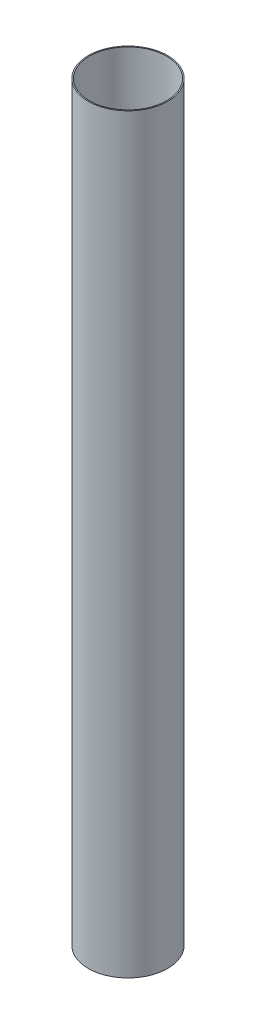
ISO-10303-21;
HEADER;
FILE_DESCRIPTION(('STEP AP214'),'2;1');
FILE_NAME('part.step','',(''),(''),'','','');
FILE_SCHEMA(('AUTOMOTIVE_DESIGN { 1 0 10303 214 1 1 1 1 }'));
ENDSEC;
DATA;
#1=APPLICATION_CONTEXT('core data for automotive mechanical design processes');
#2=APPLICATION_PROTOCOL_DEFINITION('international standard','automotive_design',2000,#1);
#3=PRODUCT_CONTEXT('',#1,'mechanical');
#4=PRODUCT('Part','Part','',(#3));
#5=PRODUCT_RELATED_PRODUCT_CATEGORY('part','',(#4));
#6=PRODUCT_DEFINITION_FORMATION('','',#4);
#7=PRODUCT_DEFINITION_CONTEXT('part definition',#1,'design');
#8=PRODUCT_DEFINITION('design','',#6,#7);
#9=PRODUCT_DEFINITION_SHAPE('','',#8);
#10=(LENGTH_UNIT() NAMED_UNIT(*) SI_UNIT(.MILLI.,.METRE.));
#11=(NAMED_UNIT(*) PLANE_ANGLE_UNIT() SI_UNIT($,.RADIAN.));
#12=(NAMED_UNIT(*) SI_UNIT($,.STERADIAN.) SOLID_ANGLE_UNIT());
#13=UNCERTAINTY_MEASURE_WITH_UNIT(LENGTH_MEASURE(1.E-05),#10,'distance_accuracy_value','');
#14=(GEOMETRIC_REPRESENTATION_CONTEXT(3) GLOBAL_UNCERTAINTY_ASSIGNED_CONTEXT((#13)) GLOBAL_UNIT_ASSIGNED_CONTEXT((#10,
#11,#12)) REPRESENTATION_CONTEXT('',''));
#15=CARTESIAN_POINT('',(0.,0.,0.));
#16=DIRECTION('',(0.,0.,1.));
#17=DIRECTION('',(1.,0.,0.));
#18=AXIS2_PLACEMENT_3D('',#15,#16,#17);
#19=CARTESIAN_POINT('',(0.,871.66666662,0.));
#20=DIRECTION('',(0.,1.,0.));
#21=DIRECTION('',(0.,0.,1.));
#22=AXIS2_PLACEMENT_3D('',#19,#20,#21);
#23=PLANE('',#22);
#24=CARTESIAN_POINT('',(0.,871.66666662,0.));
#25=DIRECTION('',(0.,1.,0.));
#26=DIRECTION('',(0.,0.,1.));
#27=AXIS2_PLACEMENT_3D('',#24,#25,#26);
#28=CIRCLE('',#27,46.1137);
#29=CARTESIAN_POINT('',(0.,871.66666662,46.1137));
#30=VERTEX_POINT('',#29);
#31=EDGE_CURVE('E10',#30,#30,#28,.T.);
#32=ORIENTED_EDGE('',*,*,#31,.T.);
#33=EDGE_LOOP('',(#32));
#34=FACE_BOUND('',#33,.T.);
#35=CARTESIAN_POINT('',(0.,871.66666662,0.));
#36=DIRECTION('',(0.,1.,0.));
#37=DIRECTION('',(0.,0.,1.));
#38=AXIS2_PLACEMENT_3D('',#35,#36,#37);
#39=CIRCLE('',#38,44.8437);
#40=CARTESIAN_POINT('',(0.,871.66666662,44.8437));
#41=VERTEX_POINT('',#40);
#42=EDGE_CURVE('E40',#41,#41,#39,.T.);
#43=ORIENTED_EDGE('',*,*,#42,.F.);
#44=EDGE_LOOP('',(#43));
#45=FACE_BOUND('',#44,.T.);
#46=ADVANCED_FACE('F29',(#34,#45),#23,.T.);
#47=CARTESIAN_POINT('',(0.,0.,0.));
#48=DIRECTION('',(0.,1.,0.));
#49=DIRECTION('',(0.,0.,1.));
#50=AXIS2_PLACEMENT_3D('',#47,#48,#49);
#51=PLANE('',#50);
#52=CARTESIAN_POINT('',(0.,0.,0.));
#53=DIRECTION('',(0.,1.,0.));
#54=DIRECTION('',(0.,0.,1.));
#55=AXIS2_PLACEMENT_3D('',#52,#53,#54);
#56=CIRCLE('',#55,46.1137);
#57=CARTESIAN_POINT('',(0.,0.,46.1137));
#58=VERTEX_POINT('',#57);
#59=EDGE_CURVE('E33',#58,#58,#56,.T.);
#60=ORIENTED_EDGE('',*,*,#59,.F.);
#61=EDGE_LOOP('',(#60));
#62=FACE_BOUND('',#61,.T.);
#63=CARTESIAN_POINT('',(0.,0.,0.));
#64=DIRECTION('',(0.,1.,0.));
#65=DIRECTION('',(0.,0.,1.));
#66=AXIS2_PLACEMENT_3D('',#63,#64,#65);
#67=CIRCLE('',#66,44.8437);
#68=CARTESIAN_POINT('',(0.,0.,44.8437));
#69=VERTEX_POINT('',#68);
#70=EDGE_CURVE('E42',#69,#69,#67,.T.);
#71=ORIENTED_EDGE('',*,*,#70,.T.);
#72=EDGE_LOOP('',(#71));
#73=FACE_BOUND('',#72,.T.);
#74=ADVANCED_FACE('F52',(#62,#73),#51,.F.);
#75=CARTESIAN_POINT('',(0.,871.66666662,0.));
#76=DIRECTION('',(0.,-1.,0.));
#77=DIRECTION('',(0.,0.,-1.));
#78=AXIS2_PLACEMENT_3D('',#75,#76,#77);
#79=CYLINDRICAL_SURFACE('',#78,46.1137);
#80=ORIENTED_EDGE('',*,*,#31,.F.);
#81=EDGE_LOOP('',(#80));
#82=FACE_BOUND('',#81,.T.);
#83=ORIENTED_EDGE('',*,*,#59,.T.);
#84=EDGE_LOOP('',(#83));
#85=FACE_BOUND('',#84,.T.);
#86=ADVANCED_FACE('F31',(#82,#85),#79,.T.);
#87=CARTESIAN_POINT('',(0.,871.66666662,0.));
#88=DIRECTION('',(0.,-1.,0.));
#89=DIRECTION('',(0.,0.,-1.));
#90=AXIS2_PLACEMENT_3D('',#87,#88,#89);
#91=CYLINDRICAL_SURFACE('',#90,44.8437);
#92=ORIENTED_EDGE('',*,*,#42,.T.);
#93=EDGE_LOOP('',(#92));
#94=FACE_BOUND('',#93,.T.);
#95=ORIENTED_EDGE('',*,*,#70,.F.);
#96=EDGE_LOOP('',(#95));
#97=FACE_BOUND('',#96,.T.);
#98=ADVANCED_FACE('F48',(#94,#97),#91,.F.);
#99=CLOSED_SHELL('',(#46,#74,#86,#98));
#100=MANIFOLD_SOLID_BREP('B2',#99);
#101=ADVANCED_BREP_SHAPE_REPRESENTATION('',(#18,#100),#14);
#102=SHAPE_DEFINITION_REPRESENTATION(#9,#101);
ENDSEC;
END-ISO-10303-21;
